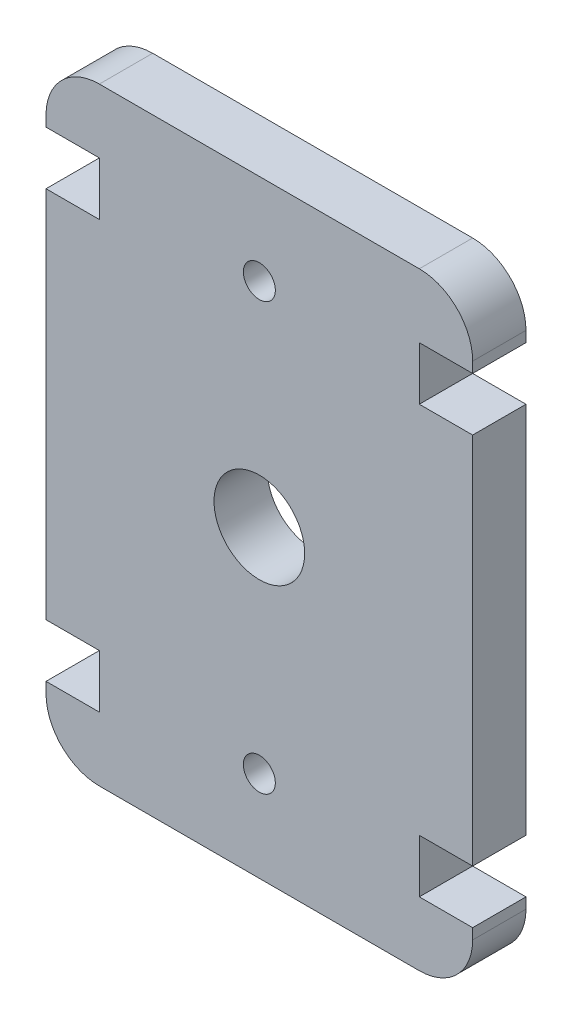
ISO-10303-21;
HEADER;
FILE_DESCRIPTION(('STEP AP214'),'2;1');
FILE_NAME('part.step','',(''),(''),'','','');
FILE_SCHEMA(('AUTOMOTIVE_DESIGN { 1 0 10303 214 1 1 1 1 }'));
ENDSEC;
DATA;
#1=APPLICATION_CONTEXT('core data for automotive mechanical design processes');
#2=APPLICATION_PROTOCOL_DEFINITION('international standard','automotive_design',2000,#1);
#3=PRODUCT_CONTEXT('',#1,'mechanical');
#4=PRODUCT('Part','Part','',(#3));
#5=PRODUCT_RELATED_PRODUCT_CATEGORY('part','',(#4));
#6=PRODUCT_DEFINITION_FORMATION('','',#4);
#7=PRODUCT_DEFINITION_CONTEXT('part definition',#1,'design');
#8=PRODUCT_DEFINITION('design','',#6,#7);
#9=PRODUCT_DEFINITION_SHAPE('','',#8);
#10=(LENGTH_UNIT() NAMED_UNIT(*) SI_UNIT(.MILLI.,.METRE.));
#11=(NAMED_UNIT(*) PLANE_ANGLE_UNIT() SI_UNIT($,.RADIAN.));
#12=(NAMED_UNIT(*) SI_UNIT($,.STERADIAN.) SOLID_ANGLE_UNIT());
#13=UNCERTAINTY_MEASURE_WITH_UNIT(LENGTH_MEASURE(1.E-05),#10,'distance_accuracy_value','');
#14=(GEOMETRIC_REPRESENTATION_CONTEXT(3) GLOBAL_UNCERTAINTY_ASSIGNED_CONTEXT((#13)) GLOBAL_UNIT_ASSIGNED_CONTEXT((#10,
#11,#12)) REPRESENTATION_CONTEXT('',''));
#15=CARTESIAN_POINT('',(0.,0.,0.));
#16=DIRECTION('',(0.,0.,1.));
#17=DIRECTION('',(1.,0.,0.));
#18=AXIS2_PLACEMENT_3D('',#15,#16,#17);
#19=CARTESIAN_POINT('',(0.,0.,5.));
#20=DIRECTION('',(0.,0.,1.));
#21=DIRECTION('',(1.,0.,0.));
#22=AXIS2_PLACEMENT_3D('',#19,#20,#21);
#23=PLANE('',#22);
#24=CARTESIAN_POINT('',(0.,8.50000000000009,5.));
#25=DIRECTION('',(0.,0.,1.));
#26=DIRECTION('',(1.,0.,0.));
#27=AXIS2_PLACEMENT_3D('',#24,#25,#26);
#28=CIRCLE('',#27,1.5);
#29=CARTESIAN_POINT('',(1.5,8.50000000000009,5.));
#30=VERTEX_POINT('',#29);
#31=EDGE_CURVE('E395',#30,#30,#28,.T.);
#32=ORIENTED_EDGE('',*,*,#31,.F.);
#33=EDGE_LOOP('',(#32));
#34=FACE_BOUND('',#33,.T.);
#35=DIRECTION('',(0.,1.,0.));
#36=VECTOR('',#35,1.);
#37=CARTESIAN_POINT('',(20.,51.,5.));
#38=LINE('',#37,#36);
#39=CARTESIAN_POINT('',(20.,51.,5.));
#40=VERTEX_POINT('',#39);
#41=CARTESIAN_POINT('',(20.,52.0000000000001,5.));
#42=VERTEX_POINT('',#41);
#43=EDGE_CURVE('E233',#40,#42,#38,.T.);
#44=ORIENTED_EDGE('',*,*,#43,.T.);
#45=CARTESIAN_POINT('',(15.,52.0000000000001,5.));
#46=DIRECTION('',(0.,0.,1.));
#47=DIRECTION('',(1.,0.,0.));
#48=AXIS2_PLACEMENT_3D('',#45,#46,#47);
#49=CIRCLE('',#48,5.);
#50=CARTESIAN_POINT('',(15.,57.0000000000001,5.));
#51=VERTEX_POINT('',#50);
#52=EDGE_CURVE('E359',#42,#51,#49,.T.);
#53=ORIENTED_EDGE('',*,*,#52,.T.);
#54=DIRECTION('',(-1.,0.,0.));
#55=VECTOR('',#54,1.);
#56=CARTESIAN_POINT('',(20.,57.0000000000001,5.));
#57=LINE('',#56,#55);
#58=CARTESIAN_POINT('',(-15.,57.0000000000001,5.));
#59=VERTEX_POINT('',#58);
#60=EDGE_CURVE('E235',#51,#59,#57,.T.);
#61=ORIENTED_EDGE('',*,*,#60,.T.);
#62=CARTESIAN_POINT('',(-15.,52.0000000000001,5.));
#63=DIRECTION('',(0.,0.,1.));
#64=DIRECTION('',(1.,0.,0.));
#65=AXIS2_PLACEMENT_3D('',#62,#63,#64);
#66=CIRCLE('',#65,5.);
#67=CARTESIAN_POINT('',(-20.,52.0000000000001,5.));
#68=VERTEX_POINT('',#67);
#69=EDGE_CURVE('E49',#59,#68,#66,.T.);
#70=ORIENTED_EDGE('',*,*,#69,.T.);
#71=DIRECTION('',(0.,-1.,0.));
#72=VECTOR('',#71,1.);
#73=CARTESIAN_POINT('',(-20.,57.0000000000001,5.));
#74=LINE('',#73,#72);
#75=CARTESIAN_POINT('',(-20.,51.,5.));
#76=VERTEX_POINT('',#75);
#77=EDGE_CURVE('E237',#68,#76,#74,.T.);
#78=ORIENTED_EDGE('',*,*,#77,.T.);
#79=DIRECTION('',(1.,0.,0.));
#80=VECTOR('',#79,1.);
#81=CARTESIAN_POINT('',(-20.,51.,5.));
#82=LINE('',#81,#80);
#83=CARTESIAN_POINT('',(-15.,51.,5.));
#84=VERTEX_POINT('',#83);
#85=EDGE_CURVE('E239',#76,#84,#82,.T.);
#86=ORIENTED_EDGE('',*,*,#85,.T.);
#87=DIRECTION('',(0.,-1.,0.));
#88=VECTOR('',#87,1.);
#89=CARTESIAN_POINT('',(-15.,51.,5.));
#90=LINE('',#89,#88);
#91=CARTESIAN_POINT('',(-15.,46.,5.));
#92=VERTEX_POINT('',#91);
#93=EDGE_CURVE('E241',#84,#92,#90,.T.);
#94=ORIENTED_EDGE('',*,*,#93,.T.);
#95=DIRECTION('',(-1.,0.,0.));
#96=VECTOR('',#95,1.);
#97=CARTESIAN_POINT('',(-15.,46.,5.));
#98=LINE('',#97,#96);
#99=CARTESIAN_POINT('',(-20.,46.,5.));
#100=VERTEX_POINT('',#99);
#101=EDGE_CURVE('E243',#92,#100,#98,.T.);
#102=ORIENTED_EDGE('',*,*,#101,.T.);
#103=DIRECTION('',(0.,-1.,0.));
#104=VECTOR('',#103,1.);
#105=CARTESIAN_POINT('',(-20.,46.,5.));
#106=LINE('',#105,#104);
#107=CARTESIAN_POINT('',(-20.,11.0000000000001,5.));
#108=VERTEX_POINT('',#107);
#109=EDGE_CURVE('E245',#100,#108,#106,.T.);
#110=ORIENTED_EDGE('',*,*,#109,.T.);
#111=DIRECTION('',(1.,0.,0.));
#112=VECTOR('',#111,1.);
#113=CARTESIAN_POINT('',(-20.,11.0000000000001,5.));
#114=LINE('',#113,#112);
#115=CARTESIAN_POINT('',(-15.,11.,5.));
#116=VERTEX_POINT('',#115);
#117=EDGE_CURVE('E247',#108,#116,#114,.T.);
#118=ORIENTED_EDGE('',*,*,#117,.T.);
#119=DIRECTION('',(0.,-1.,0.));
#120=VECTOR('',#119,1.);
#121=CARTESIAN_POINT('',(-15.,11.,5.));
#122=LINE('',#121,#120);
#123=CARTESIAN_POINT('',(-15.,6.,5.));
#124=VERTEX_POINT('',#123);
#125=EDGE_CURVE('E249',#116,#124,#122,.T.);
#126=ORIENTED_EDGE('',*,*,#125,.T.);
#127=DIRECTION('',(-1.,0.,0.));
#128=VECTOR('',#127,1.);
#129=CARTESIAN_POINT('',(-15.,6.,5.));
#130=LINE('',#129,#128);
#131=CARTESIAN_POINT('',(-20.,6.00000000000009,5.));
#132=VERTEX_POINT('',#131);
#133=EDGE_CURVE('E251',#124,#132,#130,.T.);
#134=ORIENTED_EDGE('',*,*,#133,.T.);
#135=DIRECTION('',(0.,-1.,0.));
#136=VECTOR('',#135,1.);
#137=CARTESIAN_POINT('',(-20.,6.00000000000009,5.));
#138=LINE('',#137,#136);
#139=CARTESIAN_POINT('',(-20.,5.,5.));
#140=VERTEX_POINT('',#139);
#141=EDGE_CURVE('E298',#132,#140,#138,.T.);
#142=ORIENTED_EDGE('',*,*,#141,.T.);
#143=CARTESIAN_POINT('',(-15.,5.,5.));
#144=DIRECTION('',(0.,0.,1.));
#145=DIRECTION('',(1.,0.,0.));
#146=AXIS2_PLACEMENT_3D('',#143,#144,#145);
#147=CIRCLE('',#146,5.);
#148=CARTESIAN_POINT('',(-15.,0.,5.));
#149=VERTEX_POINT('',#148);
#150=EDGE_CURVE('E356',#140,#149,#147,.T.);
#151=ORIENTED_EDGE('',*,*,#150,.T.);
#152=DIRECTION('',(1.,0.,0.));
#153=VECTOR('',#152,1.);
#154=CARTESIAN_POINT('',(-20.,0.,5.));
#155=LINE('',#154,#153);
#156=CARTESIAN_POINT('',(15.,0.,5.));
#157=VERTEX_POINT('',#156);
#158=EDGE_CURVE('E203',#149,#157,#155,.T.);
#159=ORIENTED_EDGE('',*,*,#158,.T.);
#160=CARTESIAN_POINT('',(15.,5.,5.));
#161=DIRECTION('',(0.,0.,1.));
#162=DIRECTION('',(1.,0.,0.));
#163=AXIS2_PLACEMENT_3D('',#160,#161,#162);
#164=CIRCLE('',#163,5.);
#165=CARTESIAN_POINT('',(20.,5.,5.));
#166=VERTEX_POINT('',#165);
#167=EDGE_CURVE('E56',#157,#166,#164,.T.);
#168=ORIENTED_EDGE('',*,*,#167,.T.);
#169=DIRECTION('',(0.,1.,0.));
#170=VECTOR('',#169,1.);
#171=CARTESIAN_POINT('',(20.,0.,5.));
#172=LINE('',#171,#170);
#173=CARTESIAN_POINT('',(20.,6.0000000000001,5.));
#174=VERTEX_POINT('',#173);
#175=EDGE_CURVE('E193',#166,#174,#172,.T.);
#176=ORIENTED_EDGE('',*,*,#175,.T.);
#177=DIRECTION('',(-1.,0.,0.));
#178=VECTOR('',#177,1.);
#179=CARTESIAN_POINT('',(20.,6.0000000000001,5.));
#180=LINE('',#179,#178);
#181=CARTESIAN_POINT('',(15.,6.,5.));
#182=VERTEX_POINT('',#181);
#183=EDGE_CURVE('E198',#174,#182,#180,.T.);
#184=ORIENTED_EDGE('',*,*,#183,.T.);
#185=DIRECTION('',(0.,1.,0.));
#186=VECTOR('',#185,1.);
#187=CARTESIAN_POINT('',(15.,6.,5.));
#188=LINE('',#187,#186);
#189=CARTESIAN_POINT('',(15.,11.,5.));
#190=VERTEX_POINT('',#189);
#191=EDGE_CURVE('E218',#182,#190,#188,.T.);
#192=ORIENTED_EDGE('',*,*,#191,.T.);
#193=DIRECTION('',(1.,0.,0.));
#194=VECTOR('',#193,1.);
#195=CARTESIAN_POINT('',(15.,11.,5.));
#196=LINE('',#195,#194);
#197=CARTESIAN_POINT('',(20.,11.0000000000001,5.));
#198=VERTEX_POINT('',#197);
#199=EDGE_CURVE('E220',#190,#198,#196,.T.);
#200=ORIENTED_EDGE('',*,*,#199,.T.);
#201=DIRECTION('',(0.,1.,0.));
#202=VECTOR('',#201,1.);
#203=CARTESIAN_POINT('',(20.,11.0000000000001,5.));
#204=LINE('',#203,#202);
#205=CARTESIAN_POINT('',(20.,46.,5.));
#206=VERTEX_POINT('',#205);
#207=EDGE_CURVE('E225',#198,#206,#204,.T.);
#208=ORIENTED_EDGE('',*,*,#207,.T.);
#209=DIRECTION('',(-1.,0.,0.));
#210=VECTOR('',#209,1.);
#211=CARTESIAN_POINT('',(20.,46.,5.));
#212=LINE('',#211,#210);
#213=CARTESIAN_POINT('',(15.,46.,5.));
#214=VERTEX_POINT('',#213);
#215=EDGE_CURVE('E227',#206,#214,#212,.T.);
#216=ORIENTED_EDGE('',*,*,#215,.T.);
#217=DIRECTION('',(0.,1.,0.));
#218=VECTOR('',#217,1.);
#219=CARTESIAN_POINT('',(15.,46.,5.));
#220=LINE('',#219,#218);
#221=CARTESIAN_POINT('',(15.,51.,5.));
#222=VERTEX_POINT('',#221);
#223=EDGE_CURVE('E229',#214,#222,#220,.T.);
#224=ORIENTED_EDGE('',*,*,#223,.T.);
#225=DIRECTION('',(1.,0.,0.));
#226=VECTOR('',#225,1.);
#227=CARTESIAN_POINT('',(15.,51.,5.));
#228=LINE('',#227,#226);
#229=EDGE_CURVE('E231',#222,#40,#228,.T.);
#230=ORIENTED_EDGE('',*,*,#229,.T.);
#231=EDGE_LOOP('',(#44,#53,#61,#70,#78,#86,#94,#102,#110,#118,#126,#134,#142,#151,#159,#168,
#176,#184,#192,#200,#208,#216,#224,#230));
#232=FACE_BOUND('',#231,.T.);
#233=CARTESIAN_POINT('',(0.,48.5,5.));
#234=DIRECTION('',(0.,0.,1.));
#235=DIRECTION('',(1.,0.,0.));
#236=AXIS2_PLACEMENT_3D('',#233,#234,#235);
#237=CIRCLE('',#236,1.5);
#238=CARTESIAN_POINT('',(1.5,48.5,5.));
#239=VERTEX_POINT('',#238);
#240=EDGE_CURVE('E258',#239,#239,#237,.T.);
#241=ORIENTED_EDGE('',*,*,#240,.F.);
#242=EDGE_LOOP('',(#241));
#243=FACE_BOUND('',#242,.T.);
#244=CARTESIAN_POINT('',(0.,28.5,5.));
#245=DIRECTION('',(0.,0.,1.));
#246=DIRECTION('',(1.,0.,0.));
#247=AXIS2_PLACEMENT_3D('',#244,#245,#246);
#248=CIRCLE('',#247,4.25);
#249=CARTESIAN_POINT('',(4.25,28.5,5.));
#250=VERTEX_POINT('',#249);
#251=EDGE_CURVE('E401',#250,#250,#248,.T.);
#252=ORIENTED_EDGE('',*,*,#251,.F.);
#253=EDGE_LOOP('',(#252));
#254=FACE_BOUND('',#253,.T.);
#255=ADVANCED_FACE('F34',(#34,#232,#243,#254),#23,.T.);
#256=CARTESIAN_POINT('',(0.,0.,0.));
#257=DIRECTION('',(0.,0.,1.));
#258=DIRECTION('',(1.,0.,0.));
#259=AXIS2_PLACEMENT_3D('',#256,#257,#258);
#260=PLANE('',#259);
#261=DIRECTION('',(-1.,0.,0.));
#262=VECTOR('',#261,1.);
#263=CARTESIAN_POINT('',(20.,57.0000000000001,0.));
#264=LINE('',#263,#262);
#265=CARTESIAN_POINT('',(15.,57.0000000000001,0.));
#266=VERTEX_POINT('',#265);
#267=CARTESIAN_POINT('',(-15.,57.0000000000001,0.));
#268=VERTEX_POINT('',#267);
#269=EDGE_CURVE('E279',#266,#268,#264,.T.);
#270=ORIENTED_EDGE('',*,*,#269,.F.);
#271=CARTESIAN_POINT('',(15.,52.0000000000001,0.));
#272=DIRECTION('',(0.,0.,1.));
#273=DIRECTION('',(1.,0.,0.));
#274=AXIS2_PLACEMENT_3D('',#271,#272,#273);
#275=CIRCLE('',#274,5.);
#276=CARTESIAN_POINT('',(20.,52.0000000000001,0.));
#277=VERTEX_POINT('',#276);
#278=EDGE_CURVE('E351',#266,#277,#275,.F.);
#279=ORIENTED_EDGE('',*,*,#278,.T.);
#280=DIRECTION('',(0.,1.,0.));
#281=VECTOR('',#280,1.);
#282=CARTESIAN_POINT('',(20.,51.,0.));
#283=LINE('',#282,#281);
#284=CARTESIAN_POINT('',(20.,51.,0.));
#285=VERTEX_POINT('',#284);
#286=EDGE_CURVE('E276',#285,#277,#283,.T.);
#287=ORIENTED_EDGE('',*,*,#286,.F.);
#288=DIRECTION('',(1.,0.,0.));
#289=VECTOR('',#288,1.);
#290=CARTESIAN_POINT('',(15.,51.,0.));
#291=LINE('',#290,#289);
#292=CARTESIAN_POINT('',(15.,51.,0.));
#293=VERTEX_POINT('',#292);
#294=EDGE_CURVE('E274',#293,#285,#291,.T.);
#295=ORIENTED_EDGE('',*,*,#294,.F.);
#296=DIRECTION('',(0.,1.,0.));
#297=VECTOR('',#296,1.);
#298=CARTESIAN_POINT('',(15.,46.,0.));
#299=LINE('',#298,#297);
#300=CARTESIAN_POINT('',(15.,46.,0.));
#301=VERTEX_POINT('',#300);
#302=EDGE_CURVE('E272',#301,#293,#299,.T.);
#303=ORIENTED_EDGE('',*,*,#302,.F.);
#304=DIRECTION('',(-1.,0.,0.));
#305=VECTOR('',#304,1.);
#306=CARTESIAN_POINT('',(20.,46.,0.));
#307=LINE('',#306,#305);
#308=CARTESIAN_POINT('',(20.,46.,0.));
#309=VERTEX_POINT('',#308);
#310=EDGE_CURVE('E270',#309,#301,#307,.T.);
#311=ORIENTED_EDGE('',*,*,#310,.F.);
#312=DIRECTION('',(0.,1.,0.));
#313=VECTOR('',#312,1.);
#314=CARTESIAN_POINT('',(20.,11.0000000000001,0.));
#315=LINE('',#314,#313);
#316=CARTESIAN_POINT('',(20.,11.0000000000001,0.));
#317=VERTEX_POINT('',#316);
#318=EDGE_CURVE('E268',#317,#309,#315,.T.);
#319=ORIENTED_EDGE('',*,*,#318,.F.);
#320=DIRECTION('',(1.,0.,0.));
#321=VECTOR('',#320,1.);
#322=CARTESIAN_POINT('',(15.,11.,0.));
#323=LINE('',#322,#321);
#324=CARTESIAN_POINT('',(15.,11.,0.));
#325=VERTEX_POINT('',#324);
#326=EDGE_CURVE('E266',#325,#317,#323,.T.);
#327=ORIENTED_EDGE('',*,*,#326,.F.);
#328=DIRECTION('',(0.,1.,0.));
#329=VECTOR('',#328,1.);
#330=CARTESIAN_POINT('',(15.,6.,0.));
#331=LINE('',#330,#329);
#332=CARTESIAN_POINT('',(15.,6.,0.));
#333=VERTEX_POINT('',#332);
#334=EDGE_CURVE('E264',#333,#325,#331,.T.);
#335=ORIENTED_EDGE('',*,*,#334,.F.);
#336=DIRECTION('',(-1.,0.,0.));
#337=VECTOR('',#336,1.);
#338=CARTESIAN_POINT('',(20.,6.0000000000001,0.));
#339=LINE('',#338,#337);
#340=CARTESIAN_POINT('',(20.,6.0000000000001,0.));
#341=VERTEX_POINT('',#340);
#342=EDGE_CURVE('E262',#341,#333,#339,.T.);
#343=ORIENTED_EDGE('',*,*,#342,.F.);
#344=DIRECTION('',(0.,1.,0.));
#345=VECTOR('',#344,1.);
#346=CARTESIAN_POINT('',(20.,0.,0.));
#347=LINE('',#346,#345);
#348=CARTESIAN_POINT('',(20.,5.,0.));
#349=VERTEX_POINT('',#348);
#350=EDGE_CURVE('E209',#349,#341,#347,.T.);
#351=ORIENTED_EDGE('',*,*,#350,.F.);
#352=CARTESIAN_POINT('',(15.,5.,0.));
#353=DIRECTION('',(0.,0.,1.));
#354=DIRECTION('',(1.,0.,0.));
#355=AXIS2_PLACEMENT_3D('',#352,#353,#354);
#356=CIRCLE('',#355,5.);
#357=CARTESIAN_POINT('',(15.,0.,0.));
#358=VERTEX_POINT('',#357);
#359=EDGE_CURVE('E349',#349,#358,#356,.F.);
#360=ORIENTED_EDGE('',*,*,#359,.T.);
#361=DIRECTION('',(1.,0.,0.));
#362=VECTOR('',#361,1.);
#363=CARTESIAN_POINT('',(-20.,0.,0.));
#364=LINE('',#363,#362);
#365=CARTESIAN_POINT('',(-15.,0.,0.));
#366=VERTEX_POINT('',#365);
#367=EDGE_CURVE('E257',#366,#358,#364,.T.);
#368=ORIENTED_EDGE('',*,*,#367,.F.);
#369=CARTESIAN_POINT('',(-15.,5.,0.));
#370=DIRECTION('',(0.,0.,1.));
#371=DIRECTION('',(1.,0.,0.));
#372=AXIS2_PLACEMENT_3D('',#369,#370,#371);
#373=CIRCLE('',#372,5.);
#374=CARTESIAN_POINT('',(-20.,5.,0.));
#375=VERTEX_POINT('',#374);
#376=EDGE_CURVE('E347',#366,#375,#373,.F.);
#377=ORIENTED_EDGE('',*,*,#376,.T.);
#378=DIRECTION('',(0.,-1.,0.));
#379=VECTOR('',#378,1.);
#380=CARTESIAN_POINT('',(-20.,6.00000000000009,0.));
#381=LINE('',#380,#379);
#382=CARTESIAN_POINT('',(-20.,6.00000000000009,0.));
#383=VERTEX_POINT('',#382);
#384=EDGE_CURVE('E254',#383,#375,#381,.T.);
#385=ORIENTED_EDGE('',*,*,#384,.F.);
#386=DIRECTION('',(-1.,0.,0.));
#387=VECTOR('',#386,1.);
#388=CARTESIAN_POINT('',(-15.,6.,0.));
#389=LINE('',#388,#387);
#390=CARTESIAN_POINT('',(-15.,6.,0.));
#391=VERTEX_POINT('',#390);
#392=EDGE_CURVE('E296',#391,#383,#389,.T.);
#393=ORIENTED_EDGE('',*,*,#392,.F.);
#394=DIRECTION('',(0.,-1.,0.));
#395=VECTOR('',#394,1.);
#396=CARTESIAN_POINT('',(-15.,11.,0.));
#397=LINE('',#396,#395);
#398=CARTESIAN_POINT('',(-15.,11.,0.));
#399=VERTEX_POINT('',#398);
#400=EDGE_CURVE('E294',#399,#391,#397,.T.);
#401=ORIENTED_EDGE('',*,*,#400,.F.);
#402=DIRECTION('',(1.,0.,0.));
#403=VECTOR('',#402,1.);
#404=CARTESIAN_POINT('',(-20.,11.0000000000001,0.));
#405=LINE('',#404,#403);
#406=CARTESIAN_POINT('',(-20.,11.0000000000001,0.));
#407=VERTEX_POINT('',#406);
#408=EDGE_CURVE('E292',#407,#399,#405,.T.);
#409=ORIENTED_EDGE('',*,*,#408,.F.);
#410=DIRECTION('',(0.,-1.,0.));
#411=VECTOR('',#410,1.);
#412=CARTESIAN_POINT('',(-20.,46.,0.));
#413=LINE('',#412,#411);
#414=CARTESIAN_POINT('',(-20.,46.,0.));
#415=VERTEX_POINT('',#414);
#416=EDGE_CURVE('E290',#415,#407,#413,.T.);
#417=ORIENTED_EDGE('',*,*,#416,.F.);
#418=DIRECTION('',(-1.,0.,0.));
#419=VECTOR('',#418,1.);
#420=CARTESIAN_POINT('',(-15.,46.,0.));
#421=LINE('',#420,#419);
#422=CARTESIAN_POINT('',(-15.,46.,0.));
#423=VERTEX_POINT('',#422);
#424=EDGE_CURVE('E288',#423,#415,#421,.T.);
#425=ORIENTED_EDGE('',*,*,#424,.F.);
#426=DIRECTION('',(0.,-1.,0.));
#427=VECTOR('',#426,1.);
#428=CARTESIAN_POINT('',(-15.,51.,0.));
#429=LINE('',#428,#427);
#430=CARTESIAN_POINT('',(-15.,51.,0.));
#431=VERTEX_POINT('',#430);
#432=EDGE_CURVE('E286',#431,#423,#429,.T.);
#433=ORIENTED_EDGE('',*,*,#432,.F.);
#434=DIRECTION('',(1.,0.,0.));
#435=VECTOR('',#434,1.);
#436=CARTESIAN_POINT('',(-20.,51.,0.));
#437=LINE('',#436,#435);
#438=CARTESIAN_POINT('',(-20.,51.,0.));
#439=VERTEX_POINT('',#438);
#440=EDGE_CURVE('E284',#439,#431,#437,.T.);
#441=ORIENTED_EDGE('',*,*,#440,.F.);
#442=DIRECTION('',(0.,-1.,0.));
#443=VECTOR('',#442,1.);
#444=CARTESIAN_POINT('',(-20.,57.0000000000001,0.));
#445=LINE('',#444,#443);
#446=CARTESIAN_POINT('',(-20.,52.0000000000001,0.));
#447=VERTEX_POINT('',#446);
#448=EDGE_CURVE('E282',#447,#439,#445,.T.);
#449=ORIENTED_EDGE('',*,*,#448,.F.);
#450=CARTESIAN_POINT('',(-15.,52.0000000000001,0.));
#451=DIRECTION('',(0.,0.,1.));
#452=DIRECTION('',(1.,0.,0.));
#453=AXIS2_PLACEMENT_3D('',#450,#451,#452);
#454=CIRCLE('',#453,5.);
#455=EDGE_CURVE('E345',#447,#268,#454,.F.);
#456=ORIENTED_EDGE('',*,*,#455,.T.);
#457=EDGE_LOOP('',(#270,#279,#287,#295,#303,#311,#319,#327,#335,#343,#351,#360,#368,#377,#385,
#393,#401,#409,#417,#425,#433,#441,#449,#456));
#458=FACE_BOUND('',#457,.T.);
#459=CARTESIAN_POINT('',(0.,48.5,0.));
#460=DIRECTION('',(0.,0.,1.));
#461=DIRECTION('',(1.,0.,0.));
#462=AXIS2_PLACEMENT_3D('',#459,#460,#461);
#463=CIRCLE('',#462,1.5);
#464=CARTESIAN_POINT('',(1.5,48.5,0.));
#465=VERTEX_POINT('',#464);
#466=EDGE_CURVE('E392',#465,#465,#463,.T.);
#467=ORIENTED_EDGE('',*,*,#466,.T.);
#468=EDGE_LOOP('',(#467));
#469=FACE_BOUND('',#468,.T.);
#470=CARTESIAN_POINT('',(0.,8.50000000000009,0.));
#471=DIRECTION('',(0.,0.,1.));
#472=DIRECTION('',(1.,0.,0.));
#473=AXIS2_PLACEMENT_3D('',#470,#471,#472);
#474=CIRCLE('',#473,1.5);
#475=CARTESIAN_POINT('',(1.5,8.50000000000009,0.));
#476=VERTEX_POINT('',#475);
#477=EDGE_CURVE('E398',#476,#476,#474,.T.);
#478=ORIENTED_EDGE('',*,*,#477,.T.);
#479=EDGE_LOOP('',(#478));
#480=FACE_BOUND('',#479,.T.);
#481=CARTESIAN_POINT('',(0.,28.5,0.));
#482=DIRECTION('',(0.,0.,1.));
#483=DIRECTION('',(1.,0.,0.));
#484=AXIS2_PLACEMENT_3D('',#481,#482,#483);
#485=CIRCLE('',#484,4.25);
#486=CARTESIAN_POINT('',(4.25,28.5,0.));
#487=VERTEX_POINT('',#486);
#488=EDGE_CURVE('E404',#487,#487,#485,.T.);
#489=ORIENTED_EDGE('',*,*,#488,.T.);
#490=EDGE_LOOP('',(#489));
#491=FACE_BOUND('',#490,.T.);
#492=ADVANCED_FACE('F387',(#458,#469,#480,#491),#260,.F.);
#493=CARTESIAN_POINT('',(-20.,6.00000000000009,5.));
#494=DIRECTION('',(1.,0.,0.));
#495=DIRECTION('',(0.,0.,-1.));
#496=AXIS2_PLACEMENT_3D('',#493,#494,#495);
#497=PLANE('',#496);
#498=ORIENTED_EDGE('',*,*,#384,.T.);
#499=DIRECTION('',(0.,0.,-1.));
#500=VECTOR('',#499,1.);
#501=CARTESIAN_POINT('',(-20.,5.,5.));
#502=LINE('',#501,#500);
#503=EDGE_CURVE('E42',#375,#140,#502,.F.);
#504=ORIENTED_EDGE('',*,*,#503,.T.);
#505=ORIENTED_EDGE('',*,*,#141,.F.);
#506=DIRECTION('',(0.,0.,-1.));
#507=VECTOR('',#506,1.);
#508=CARTESIAN_POINT('',(-20.,6.00000000000009,5.));
#509=LINE('',#508,#507);
#510=EDGE_CURVE('E253',#132,#383,#509,.T.);
#511=ORIENTED_EDGE('',*,*,#510,.T.);
#512=EDGE_LOOP('',(#498,#504,#505,#511));
#513=FACE_BOUND('',#512,.T.);
#514=ADVANCED_FACE('F371',(#513),#497,.F.);
#515=CARTESIAN_POINT('',(-20.,0.,5.));
#516=DIRECTION('',(0.,1.,0.));
#517=DIRECTION('',(0.,0.,1.));
#518=AXIS2_PLACEMENT_3D('',#515,#516,#517);
#519=PLANE('',#518);
#520=ORIENTED_EDGE('',*,*,#367,.T.);
#521=DIRECTION('',(0.,0.,-1.));
#522=VECTOR('',#521,1.);
#523=CARTESIAN_POINT('',(15.,0.,5.));
#524=LINE('',#523,#522);
#525=EDGE_CURVE('E366',#358,#157,#524,.F.);
#526=ORIENTED_EDGE('',*,*,#525,.T.);
#527=ORIENTED_EDGE('',*,*,#158,.F.);
#528=DIRECTION('',(0.,0.,-1.));
#529=VECTOR('',#528,1.);
#530=CARTESIAN_POINT('',(-15.,0.,5.));
#531=LINE('',#530,#529);
#532=EDGE_CURVE('E363',#149,#366,#531,.T.);
#533=ORIENTED_EDGE('',*,*,#532,.T.);
#534=EDGE_LOOP('',(#520,#526,#527,#533));
#535=FACE_BOUND('',#534,.T.);
#536=ADVANCED_FACE('F383',(#535),#519,.F.);
#537=CARTESIAN_POINT('',(20.,0.,5.));
#538=DIRECTION('',(-1.,0.,0.));
#539=DIRECTION('',(0.,0.,1.));
#540=AXIS2_PLACEMENT_3D('',#537,#538,#539);
#541=PLANE('',#540);
#542=ORIENTED_EDGE('',*,*,#175,.F.);
#543=DIRECTION('',(0.,0.,-1.));
#544=VECTOR('',#543,1.);
#545=CARTESIAN_POINT('',(20.,5.,5.));
#546=LINE('',#545,#544);
#547=EDGE_CURVE('E361',#166,#349,#546,.T.);
#548=ORIENTED_EDGE('',*,*,#547,.T.);
#549=ORIENTED_EDGE('',*,*,#350,.T.);
#550=DIRECTION('',(0.,0.,-1.));
#551=VECTOR('',#550,1.);
#552=CARTESIAN_POINT('',(20.,6.0000000000001,5.));
#553=LINE('',#552,#551);
#554=EDGE_CURVE('E206',#174,#341,#553,.T.);
#555=ORIENTED_EDGE('',*,*,#554,.F.);
#556=EDGE_LOOP('',(#542,#548,#549,#555));
#557=FACE_BOUND('',#556,.T.);
#558=ADVANCED_FACE('F207',(#557),#541,.F.);
#559=CARTESIAN_POINT('',(20.,6.0000000000001,5.));
#560=DIRECTION('',(0.,-1.,0.));
#561=DIRECTION('',(1.,0.,0.));
#562=AXIS2_PLACEMENT_3D('',#559,#560,#561);
#563=PLANE('',#562);
#564=ORIENTED_EDGE('',*,*,#342,.T.);
#565=DIRECTION('',(0.,0.,-1.));
#566=VECTOR('',#565,1.);
#567=CARTESIAN_POINT('',(15.,6.,5.));
#568=LINE('',#567,#566);
#569=EDGE_CURVE('E213',#182,#333,#568,.T.);
#570=ORIENTED_EDGE('',*,*,#569,.F.);
#571=ORIENTED_EDGE('',*,*,#183,.F.);
#572=ORIENTED_EDGE('',*,*,#554,.T.);
#573=EDGE_LOOP('',(#564,#570,#571,#572));
#574=FACE_BOUND('',#573,.T.);
#575=ADVANCED_FACE('F215',(#574),#563,.F.);
#576=CARTESIAN_POINT('',(15.,6.,5.));
#577=DIRECTION('',(-1.,0.,0.));
#578=DIRECTION('',(0.,0.,1.));
#579=AXIS2_PLACEMENT_3D('',#576,#577,#578);
#580=PLANE('',#579);
#581=ORIENTED_EDGE('',*,*,#334,.T.);
#582=DIRECTION('',(0.,0.,-1.));
#583=VECTOR('',#582,1.);
#584=CARTESIAN_POINT('',(15.,11.,5.));
#585=LINE('',#584,#583);
#586=EDGE_CURVE('E337',#190,#325,#585,.T.);
#587=ORIENTED_EDGE('',*,*,#586,.F.);
#588=ORIENTED_EDGE('',*,*,#191,.F.);
#589=ORIENTED_EDGE('',*,*,#569,.T.);
#590=EDGE_LOOP('',(#581,#587,#588,#589));
#591=FACE_BOUND('',#590,.T.);
#592=ADVANCED_FACE('F484',(#591),#580,.F.);
#593=CARTESIAN_POINT('',(15.,11.,5.));
#594=DIRECTION('',(0.,1.,0.));
#595=DIRECTION('',(-1.,0.,0.));
#596=AXIS2_PLACEMENT_3D('',#593,#594,#595);
#597=PLANE('',#596);
#598=ORIENTED_EDGE('',*,*,#326,.T.);
#599=DIRECTION('',(0.,0.,-1.));
#600=VECTOR('',#599,1.);
#601=CARTESIAN_POINT('',(20.,11.0000000000001,5.));
#602=LINE('',#601,#600);
#603=EDGE_CURVE('E334',#198,#317,#602,.T.);
#604=ORIENTED_EDGE('',*,*,#603,.F.);
#605=ORIENTED_EDGE('',*,*,#199,.F.);
#606=ORIENTED_EDGE('',*,*,#586,.T.);
#607=EDGE_LOOP('',(#598,#604,#605,#606));
#608=FACE_BOUND('',#607,.T.);
#609=ADVANCED_FACE('F480',(#608),#597,.F.);
#610=CARTESIAN_POINT('',(20.,11.0000000000001,5.));
#611=DIRECTION('',(-1.,0.,0.));
#612=DIRECTION('',(0.,0.,1.));
#613=AXIS2_PLACEMENT_3D('',#610,#611,#612);
#614=PLANE('',#613);
#615=ORIENTED_EDGE('',*,*,#318,.T.);
#616=DIRECTION('',(0.,0.,-1.));
#617=VECTOR('',#616,1.);
#618=CARTESIAN_POINT('',(20.,46.,5.));
#619=LINE('',#618,#617);
#620=EDGE_CURVE('E331',#206,#309,#619,.T.);
#621=ORIENTED_EDGE('',*,*,#620,.F.);
#622=ORIENTED_EDGE('',*,*,#207,.F.);
#623=ORIENTED_EDGE('',*,*,#603,.T.);
#624=EDGE_LOOP('',(#615,#621,#622,#623));
#625=FACE_BOUND('',#624,.T.);
#626=ADVANCED_FACE('F476',(#625),#614,.F.);
#627=CARTESIAN_POINT('',(20.,46.,5.));
#628=DIRECTION('',(0.,-1.,0.));
#629=DIRECTION('',(0.,0.,-1.));
#630=AXIS2_PLACEMENT_3D('',#627,#628,#629);
#631=PLANE('',#630);
#632=ORIENTED_EDGE('',*,*,#310,.T.);
#633=DIRECTION('',(0.,0.,-1.));
#634=VECTOR('',#633,1.);
#635=CARTESIAN_POINT('',(15.,46.,5.));
#636=LINE('',#635,#634);
#637=EDGE_CURVE('E328',#214,#301,#636,.T.);
#638=ORIENTED_EDGE('',*,*,#637,.F.);
#639=ORIENTED_EDGE('',*,*,#215,.F.);
#640=ORIENTED_EDGE('',*,*,#620,.T.);
#641=EDGE_LOOP('',(#632,#638,#639,#640));
#642=FACE_BOUND('',#641,.T.);
#643=ADVANCED_FACE('F472',(#642),#631,.F.);
#644=CARTESIAN_POINT('',(15.,46.,5.));
#645=DIRECTION('',(-1.,0.,0.));
#646=DIRECTION('',(0.,0.,1.));
#647=AXIS2_PLACEMENT_3D('',#644,#645,#646);
#648=PLANE('',#647);
#649=ORIENTED_EDGE('',*,*,#302,.T.);
#650=DIRECTION('',(0.,0.,-1.));
#651=VECTOR('',#650,1.);
#652=CARTESIAN_POINT('',(15.,51.,5.));
#653=LINE('',#652,#651);
#654=EDGE_CURVE('E325',#222,#293,#653,.T.);
#655=ORIENTED_EDGE('',*,*,#654,.F.);
#656=ORIENTED_EDGE('',*,*,#223,.F.);
#657=ORIENTED_EDGE('',*,*,#637,.T.);
#658=EDGE_LOOP('',(#649,#655,#656,#657));
#659=FACE_BOUND('',#658,.T.);
#660=ADVANCED_FACE('F468',(#659),#648,.F.);
#661=CARTESIAN_POINT('',(15.,51.,5.));
#662=DIRECTION('',(0.,1.,0.));
#663=DIRECTION('',(-1.,0.,0.));
#664=AXIS2_PLACEMENT_3D('',#661,#662,#663);
#665=PLANE('',#664);
#666=ORIENTED_EDGE('',*,*,#294,.T.);
#667=DIRECTION('',(0.,0.,-1.));
#668=VECTOR('',#667,1.);
#669=CARTESIAN_POINT('',(20.,51.,5.));
#670=LINE('',#669,#668);
#671=EDGE_CURVE('E322',#40,#285,#670,.T.);
#672=ORIENTED_EDGE('',*,*,#671,.F.);
#673=ORIENTED_EDGE('',*,*,#229,.F.);
#674=ORIENTED_EDGE('',*,*,#654,.T.);
#675=EDGE_LOOP('',(#666,#672,#673,#674));
#676=FACE_BOUND('',#675,.T.);
#677=ADVANCED_FACE('F464',(#676),#665,.F.);
#678=CARTESIAN_POINT('',(20.,51.,5.));
#679=DIRECTION('',(-1.,0.,0.));
#680=DIRECTION('',(0.,0.,1.));
#681=AXIS2_PLACEMENT_3D('',#678,#679,#680);
#682=PLANE('',#681);
#683=ORIENTED_EDGE('',*,*,#286,.T.);
#684=DIRECTION('',(0.,0.,-1.));
#685=VECTOR('',#684,1.);
#686=CARTESIAN_POINT('',(20.,52.0000000000001,5.));
#687=LINE('',#686,#685);
#688=EDGE_CURVE('E353',#277,#42,#687,.F.);
#689=ORIENTED_EDGE('',*,*,#688,.T.);
#690=ORIENTED_EDGE('',*,*,#43,.F.);
#691=ORIENTED_EDGE('',*,*,#671,.T.);
#692=EDGE_LOOP('',(#683,#689,#690,#691));
#693=FACE_BOUND('',#692,.T.);
#694=ADVANCED_FACE('F460',(#693),#682,.F.);
#695=CARTESIAN_POINT('',(20.,57.0000000000001,5.));
#696=DIRECTION('',(0.,-1.,0.));
#697=DIRECTION('',(0.,0.,-1.));
#698=AXIS2_PLACEMENT_3D('',#695,#696,#697);
#699=PLANE('',#698);
#700=ORIENTED_EDGE('',*,*,#60,.F.);
#701=DIRECTION('',(0.,0.,-1.));
#702=VECTOR('',#701,1.);
#703=CARTESIAN_POINT('',(15.,57.0000000000001,5.));
#704=LINE('',#703,#702);
#705=EDGE_CURVE('E342',#51,#266,#704,.T.);
#706=ORIENTED_EDGE('',*,*,#705,.T.);
#707=ORIENTED_EDGE('',*,*,#269,.T.);
#708=DIRECTION('',(0.,0.,-1.));
#709=VECTOR('',#708,1.);
#710=CARTESIAN_POINT('',(-15.,57.0000000000001,5.));
#711=LINE('',#710,#709);
#712=EDGE_CURVE('E212',#268,#59,#711,.F.);
#713=ORIENTED_EDGE('',*,*,#712,.T.);
#714=EDGE_LOOP('',(#700,#706,#707,#713));
#715=FACE_BOUND('',#714,.T.);
#716=ADVANCED_FACE('F456',(#715),#699,.F.);
#717=CARTESIAN_POINT('',(-20.,57.0000000000001,5.));
#718=DIRECTION('',(1.,0.,0.));
#719=DIRECTION('',(0.,0.,-1.));
#720=AXIS2_PLACEMENT_3D('',#717,#718,#719);
#721=PLANE('',#720);
#722=ORIENTED_EDGE('',*,*,#77,.F.);
#723=DIRECTION('',(0.,0.,-1.));
#724=VECTOR('',#723,1.);
#725=CARTESIAN_POINT('',(-20.,52.0000000000001,5.));
#726=LINE('',#725,#724);
#727=EDGE_CURVE('E11',#68,#447,#726,.T.);
#728=ORIENTED_EDGE('',*,*,#727,.T.);
#729=ORIENTED_EDGE('',*,*,#448,.T.);
#730=DIRECTION('',(0.,0.,-1.));
#731=VECTOR('',#730,1.);
#732=CARTESIAN_POINT('',(-20.,51.,5.));
#733=LINE('',#732,#731);
#734=EDGE_CURVE('E319',#76,#439,#733,.T.);
#735=ORIENTED_EDGE('',*,*,#734,.F.);
#736=EDGE_LOOP('',(#722,#728,#729,#735));
#737=FACE_BOUND('',#736,.T.);
#738=ADVANCED_FACE('F452',(#737),#721,.F.);
#739=CARTESIAN_POINT('',(-20.,51.,5.));
#740=DIRECTION('',(0.,1.,0.));
#741=DIRECTION('',(-1.,0.,0.));
#742=AXIS2_PLACEMENT_3D('',#739,#740,#741);
#743=PLANE('',#742);
#744=ORIENTED_EDGE('',*,*,#440,.T.);
#745=DIRECTION('',(0.,0.,-1.));
#746=VECTOR('',#745,1.);
#747=CARTESIAN_POINT('',(-15.,51.,5.));
#748=LINE('',#747,#746);
#749=EDGE_CURVE('E316',#84,#431,#748,.T.);
#750=ORIENTED_EDGE('',*,*,#749,.F.);
#751=ORIENTED_EDGE('',*,*,#85,.F.);
#752=ORIENTED_EDGE('',*,*,#734,.T.);
#753=EDGE_LOOP('',(#744,#750,#751,#752));
#754=FACE_BOUND('',#753,.T.);
#755=ADVANCED_FACE('F448',(#754),#743,.F.);
#756=CARTESIAN_POINT('',(-15.,51.,5.));
#757=DIRECTION('',(1.,0.,0.));
#758=DIRECTION('',(0.,0.,-1.));
#759=AXIS2_PLACEMENT_3D('',#756,#757,#758);
#760=PLANE('',#759);
#761=ORIENTED_EDGE('',*,*,#432,.T.);
#762=DIRECTION('',(0.,0.,-1.));
#763=VECTOR('',#762,1.);
#764=CARTESIAN_POINT('',(-15.,46.,5.));
#765=LINE('',#764,#763);
#766=EDGE_CURVE('E313',#92,#423,#765,.T.);
#767=ORIENTED_EDGE('',*,*,#766,.F.);
#768=ORIENTED_EDGE('',*,*,#93,.F.);
#769=ORIENTED_EDGE('',*,*,#749,.T.);
#770=EDGE_LOOP('',(#761,#767,#768,#769));
#771=FACE_BOUND('',#770,.T.);
#772=ADVANCED_FACE('F444',(#771),#760,.F.);
#773=CARTESIAN_POINT('',(-15.,46.,5.));
#774=DIRECTION('',(0.,-1.,0.));
#775=DIRECTION('',(0.,0.,-1.));
#776=AXIS2_PLACEMENT_3D('',#773,#774,#775);
#777=PLANE('',#776);
#778=ORIENTED_EDGE('',*,*,#424,.T.);
#779=DIRECTION('',(0.,0.,-1.));
#780=VECTOR('',#779,1.);
#781=CARTESIAN_POINT('',(-20.,46.,5.));
#782=LINE('',#781,#780);
#783=EDGE_CURVE('E310',#100,#415,#782,.T.);
#784=ORIENTED_EDGE('',*,*,#783,.F.);
#785=ORIENTED_EDGE('',*,*,#101,.F.);
#786=ORIENTED_EDGE('',*,*,#766,.T.);
#787=EDGE_LOOP('',(#778,#784,#785,#786));
#788=FACE_BOUND('',#787,.T.);
#789=ADVANCED_FACE('F440',(#788),#777,.F.);
#790=CARTESIAN_POINT('',(-20.,46.,5.));
#791=DIRECTION('',(1.,0.,0.));
#792=DIRECTION('',(0.,0.,-1.));
#793=AXIS2_PLACEMENT_3D('',#790,#791,#792);
#794=PLANE('',#793);
#795=ORIENTED_EDGE('',*,*,#416,.T.);
#796=DIRECTION('',(0.,0.,-1.));
#797=VECTOR('',#796,1.);
#798=CARTESIAN_POINT('',(-20.,11.0000000000001,5.));
#799=LINE('',#798,#797);
#800=EDGE_CURVE('E307',#108,#407,#799,.T.);
#801=ORIENTED_EDGE('',*,*,#800,.F.);
#802=ORIENTED_EDGE('',*,*,#109,.F.);
#803=ORIENTED_EDGE('',*,*,#783,.T.);
#804=EDGE_LOOP('',(#795,#801,#802,#803));
#805=FACE_BOUND('',#804,.T.);
#806=ADVANCED_FACE('F436',(#805),#794,.F.);
#807=CARTESIAN_POINT('',(-20.,11.0000000000001,5.));
#808=DIRECTION('',(0.,1.,0.));
#809=DIRECTION('',(-1.,0.,0.));
#810=AXIS2_PLACEMENT_3D('',#807,#808,#809);
#811=PLANE('',#810);
#812=ORIENTED_EDGE('',*,*,#408,.T.);
#813=DIRECTION('',(0.,0.,-1.));
#814=VECTOR('',#813,1.);
#815=CARTESIAN_POINT('',(-15.,11.,5.));
#816=LINE('',#815,#814);
#817=EDGE_CURVE('E304',#116,#399,#816,.T.);
#818=ORIENTED_EDGE('',*,*,#817,.F.);
#819=ORIENTED_EDGE('',*,*,#117,.F.);
#820=ORIENTED_EDGE('',*,*,#800,.T.);
#821=EDGE_LOOP('',(#812,#818,#819,#820));
#822=FACE_BOUND('',#821,.T.);
#823=ADVANCED_FACE('F432',(#822),#811,.F.);
#824=CARTESIAN_POINT('',(-15.,11.,5.));
#825=DIRECTION('',(1.,0.,0.));
#826=DIRECTION('',(0.,0.,-1.));
#827=AXIS2_PLACEMENT_3D('',#824,#825,#826);
#828=PLANE('',#827);
#829=ORIENTED_EDGE('',*,*,#400,.T.);
#830=DIRECTION('',(0.,0.,-1.));
#831=VECTOR('',#830,1.);
#832=CARTESIAN_POINT('',(-15.,6.,5.));
#833=LINE('',#832,#831);
#834=EDGE_CURVE('E301',#124,#391,#833,.T.);
#835=ORIENTED_EDGE('',*,*,#834,.F.);
#836=ORIENTED_EDGE('',*,*,#125,.F.);
#837=ORIENTED_EDGE('',*,*,#817,.T.);
#838=EDGE_LOOP('',(#829,#835,#836,#837));
#839=FACE_BOUND('',#838,.T.);
#840=ADVANCED_FACE('F428',(#839),#828,.F.);
#841=CARTESIAN_POINT('',(-15.,6.,5.));
#842=DIRECTION('',(0.,-1.,0.));
#843=DIRECTION('',(1.,0.,0.));
#844=AXIS2_PLACEMENT_3D('',#841,#842,#843);
#845=PLANE('',#844);
#846=ORIENTED_EDGE('',*,*,#392,.T.);
#847=ORIENTED_EDGE('',*,*,#510,.F.);
#848=ORIENTED_EDGE('',*,*,#133,.F.);
#849=ORIENTED_EDGE('',*,*,#834,.T.);
#850=EDGE_LOOP('',(#846,#847,#848,#849));
#851=FACE_BOUND('',#850,.T.);
#852=ADVANCED_FACE('F425',(#851),#845,.F.);
#853=CARTESIAN_POINT('',(0.,48.5,5.));
#854=DIRECTION('',(0.,0.,-1.));
#855=DIRECTION('',(-1.,0.,0.));
#856=AXIS2_PLACEMENT_3D('',#853,#854,#855);
#857=CYLINDRICAL_SURFACE('',#856,1.5);
#858=ORIENTED_EDGE('',*,*,#240,.T.);
#859=EDGE_LOOP('',(#858));
#860=FACE_BOUND('',#859,.T.);
#861=ORIENTED_EDGE('',*,*,#466,.F.);
#862=EDGE_LOOP('',(#861));
#863=FACE_BOUND('',#862,.T.);
#864=ADVANCED_FACE('F422',(#860,#863),#857,.F.);
#865=CARTESIAN_POINT('',(0.,8.50000000000009,5.));
#866=DIRECTION('',(0.,0.,-1.));
#867=DIRECTION('',(-1.,0.,0.));
#868=AXIS2_PLACEMENT_3D('',#865,#866,#867);
#869=CYLINDRICAL_SURFACE('',#868,1.5);
#870=ORIENTED_EDGE('',*,*,#31,.T.);
#871=EDGE_LOOP('',(#870));
#872=FACE_BOUND('',#871,.T.);
#873=ORIENTED_EDGE('',*,*,#477,.F.);
#874=EDGE_LOOP('',(#873));
#875=FACE_BOUND('',#874,.T.);
#876=ADVANCED_FACE('F629',(#872,#875),#869,.F.);
#877=CARTESIAN_POINT('',(0.,28.5,5.));
#878=DIRECTION('',(0.,0.,-1.));
#879=DIRECTION('',(-1.,0.,0.));
#880=AXIS2_PLACEMENT_3D('',#877,#878,#879);
#881=CYLINDRICAL_SURFACE('',#880,4.25);
#882=ORIENTED_EDGE('',*,*,#251,.T.);
#883=EDGE_LOOP('',(#882));
#884=FACE_BOUND('',#883,.T.);
#885=ORIENTED_EDGE('',*,*,#488,.F.);
#886=EDGE_LOOP('',(#885));
#887=FACE_BOUND('',#886,.T.);
#888=ADVANCED_FACE('F410',(#884,#887),#881,.F.);
#889=CARTESIAN_POINT('',(15.,52.0000000000001,5.));
#890=DIRECTION('',(0.,0.,-1.));
#891=DIRECTION('',(-1.,0.,0.));
#892=AXIS2_PLACEMENT_3D('',#889,#890,#891);
#893=CYLINDRICAL_SURFACE('',#892,5.);
#894=ORIENTED_EDGE('',*,*,#52,.F.);
#895=ORIENTED_EDGE('',*,*,#688,.F.);
#896=ORIENTED_EDGE('',*,*,#278,.F.);
#897=ORIENTED_EDGE('',*,*,#705,.F.);
#898=EDGE_LOOP('',(#894,#895,#896,#897));
#899=FACE_BOUND('',#898,.T.);
#900=ADVANCED_FACE('F497',(#899),#893,.T.);
#901=CARTESIAN_POINT('',(15.,5.,5.));
#902=DIRECTION('',(0.,0.,-1.));
#903=DIRECTION('',(-1.,0.,0.));
#904=AXIS2_PLACEMENT_3D('',#901,#902,#903);
#905=CYLINDRICAL_SURFACE('',#904,5.);
#906=ORIENTED_EDGE('',*,*,#167,.F.);
#907=ORIENTED_EDGE('',*,*,#525,.F.);
#908=ORIENTED_EDGE('',*,*,#359,.F.);
#909=ORIENTED_EDGE('',*,*,#547,.F.);
#910=EDGE_LOOP('',(#906,#907,#908,#909));
#911=FACE_BOUND('',#910,.T.);
#912=ADVANCED_FACE('F390',(#911),#905,.T.);
#913=CARTESIAN_POINT('',(-15.,5.,5.));
#914=DIRECTION('',(0.,0.,-1.));
#915=DIRECTION('',(-1.,0.,0.));
#916=AXIS2_PLACEMENT_3D('',#913,#914,#915);
#917=CYLINDRICAL_SURFACE('',#916,5.);
#918=ORIENTED_EDGE('',*,*,#150,.F.);
#919=ORIENTED_EDGE('',*,*,#503,.F.);
#920=ORIENTED_EDGE('',*,*,#376,.F.);
#921=ORIENTED_EDGE('',*,*,#532,.F.);
#922=EDGE_LOOP('',(#918,#919,#920,#921));
#923=FACE_BOUND('',#922,.T.);
#924=ADVANCED_FACE('F380',(#923),#917,.T.);
#925=CARTESIAN_POINT('',(-15.,52.0000000000001,5.));
#926=DIRECTION('',(0.,0.,-1.));
#927=DIRECTION('',(-1.,0.,0.));
#928=AXIS2_PLACEMENT_3D('',#925,#926,#927);
#929=CYLINDRICAL_SURFACE('',#928,5.);
#930=ORIENTED_EDGE('',*,*,#69,.F.);
#931=ORIENTED_EDGE('',*,*,#712,.F.);
#932=ORIENTED_EDGE('',*,*,#455,.F.);
#933=ORIENTED_EDGE('',*,*,#727,.F.);
#934=EDGE_LOOP('',(#930,#931,#932,#933));
#935=FACE_BOUND('',#934,.T.);
#936=ADVANCED_FACE('F36',(#935),#929,.T.);
#937=CLOSED_SHELL('',(#255,#492,#514,#536,#558,#575,#592,#609,#626,#643,#660,#677,#694,#716,
#738,#755,#772,#789,#806,#823,#840,#852,#864,#876,#888,#900,#912,#924,#936));
#938=MANIFOLD_SOLID_BREP('B2',#937);
#939=ADVANCED_BREP_SHAPE_REPRESENTATION('',(#18,#938),#14);
#940=SHAPE_DEFINITION_REPRESENTATION(#9,#939);
ENDSEC;
END-ISO-10303-21;
